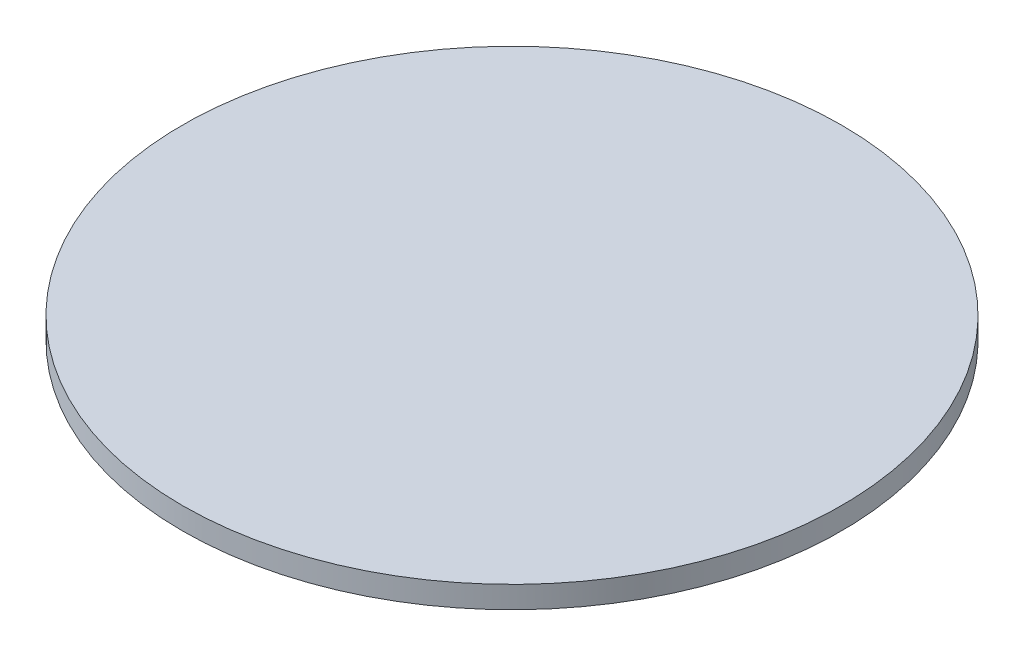
ISO-10303-21;
HEADER;
FILE_DESCRIPTION(('STEP AP214'),'2;1');
FILE_NAME('part.step','',(''),(''),'','','');
FILE_SCHEMA(('AUTOMOTIVE_DESIGN { 1 0 10303 214 1 1 1 1 }'));
ENDSEC;
DATA;
#1=APPLICATION_CONTEXT('core data for automotive mechanical design processes');
#2=APPLICATION_PROTOCOL_DEFINITION('international standard','automotive_design',2000,#1);
#3=PRODUCT_CONTEXT('',#1,'mechanical');
#4=PRODUCT('Part','Part','',(#3));
#5=PRODUCT_RELATED_PRODUCT_CATEGORY('part','',(#4));
#6=PRODUCT_DEFINITION_FORMATION('','',#4);
#7=PRODUCT_DEFINITION_CONTEXT('part definition',#1,'design');
#8=PRODUCT_DEFINITION('design','',#6,#7);
#9=PRODUCT_DEFINITION_SHAPE('','',#8);
#10=(LENGTH_UNIT() NAMED_UNIT(*) SI_UNIT(.MILLI.,.METRE.));
#11=(NAMED_UNIT(*) PLANE_ANGLE_UNIT() SI_UNIT($,.RADIAN.));
#12=(NAMED_UNIT(*) SI_UNIT($,.STERADIAN.) SOLID_ANGLE_UNIT());
#13=UNCERTAINTY_MEASURE_WITH_UNIT(LENGTH_MEASURE(1.E-05),#10,'distance_accuracy_value','');
#14=(GEOMETRIC_REPRESENTATION_CONTEXT(3) GLOBAL_UNCERTAINTY_ASSIGNED_CONTEXT((#13)) GLOBAL_UNIT_ASSIGNED_CONTEXT((#10,
#11,#12)) REPRESENTATION_CONTEXT('',''));
#15=CARTESIAN_POINT('',(0.,0.,0.));
#16=DIRECTION('',(0.,0.,1.));
#17=DIRECTION('',(1.,0.,0.));
#18=AXIS2_PLACEMENT_3D('',#15,#16,#17);
#19=CARTESIAN_POINT('',(0.,5.,0.));
#20=DIRECTION('',(0.,-1.,0.));
#21=DIRECTION('',(0.,0.,-1.));
#22=AXIS2_PLACEMENT_3D('',#19,#20,#21);
#23=CYLINDRICAL_SURFACE('',#22,75.);
#24=CARTESIAN_POINT('',(0.,5.,0.));
#25=DIRECTION('',(0.,1.,0.));
#26=DIRECTION('',(0.,0.,1.));
#27=AXIS2_PLACEMENT_3D('',#24,#25,#26);
#28=CIRCLE('',#27,75.);
#29=CARTESIAN_POINT('',(0.,5.,75.));
#30=VERTEX_POINT('',#29);
#31=EDGE_CURVE('E10',#30,#30,#28,.T.);
#32=ORIENTED_EDGE('',*,*,#31,.F.);
#33=EDGE_LOOP('',(#32));
#34=FACE_BOUND('',#33,.T.);
#35=CARTESIAN_POINT('',(0.,0.,0.));
#36=DIRECTION('',(0.,1.,0.));
#37=DIRECTION('',(0.,0.,1.));
#38=AXIS2_PLACEMENT_3D('',#35,#36,#37);
#39=CIRCLE('',#38,75.);
#40=CARTESIAN_POINT('',(0.,0.,75.));
#41=VERTEX_POINT('',#40);
#42=EDGE_CURVE('E34',#41,#41,#39,.T.);
#43=ORIENTED_EDGE('',*,*,#42,.T.);
#44=EDGE_LOOP('',(#43));
#45=FACE_BOUND('',#44,.T.);
#46=ADVANCED_FACE('F31',(#34,#45),#23,.T.);
#47=CARTESIAN_POINT('',(0.,5.,0.));
#48=DIRECTION('',(0.,1.,0.));
#49=DIRECTION('',(0.,0.,1.));
#50=AXIS2_PLACEMENT_3D('',#47,#48,#49);
#51=PLANE('',#50);
#52=ORIENTED_EDGE('',*,*,#31,.T.);
#53=EDGE_LOOP('',(#52));
#54=FACE_BOUND('',#53,.T.);
#55=ADVANCED_FACE('F46',(#54),#51,.T.);
#56=CARTESIAN_POINT('',(0.,0.,0.));
#57=DIRECTION('',(0.,1.,0.));
#58=DIRECTION('',(0.,0.,1.));
#59=AXIS2_PLACEMENT_3D('',#56,#57,#58);
#60=PLANE('',#59);
#61=ORIENTED_EDGE('',*,*,#42,.F.);
#62=EDGE_LOOP('',(#61));
#63=FACE_BOUND('',#62,.T.);
#64=ADVANCED_FACE('F44',(#63),#60,.F.);
#65=CLOSED_SHELL('',(#46,#55,#64));
#66=MANIFOLD_SOLID_BREP('B2',#65);
#67=ADVANCED_BREP_SHAPE_REPRESENTATION('',(#18,#66),#14);
#68=SHAPE_DEFINITION_REPRESENTATION(#9,#67);
ENDSEC;
END-ISO-10303-21;
